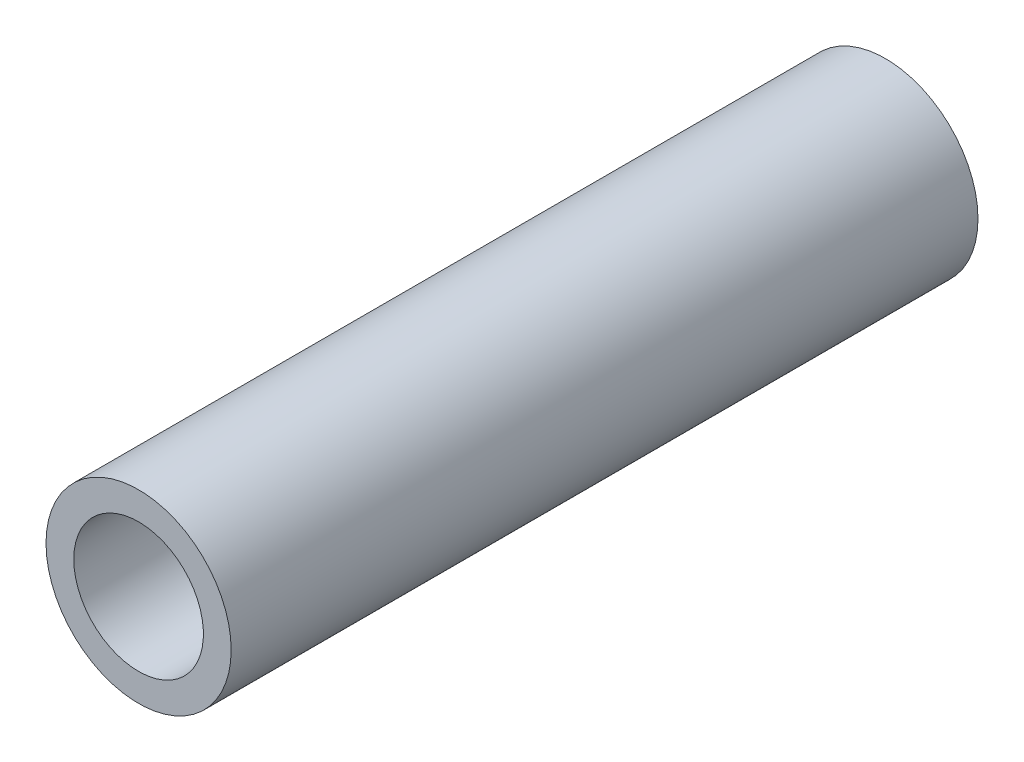
ISO-10303-21;
HEADER;
FILE_DESCRIPTION(('STEP AP214'),'2;1');
FILE_NAME('part.step','',(''),(''),'','','');
FILE_SCHEMA(('AUTOMOTIVE_DESIGN { 1 0 10303 214 1 1 1 1 }'));
ENDSEC;
DATA;
#1=APPLICATION_CONTEXT('core data for automotive mechanical design processes');
#2=APPLICATION_PROTOCOL_DEFINITION('international standard','automotive_design',2000,#1);
#3=PRODUCT_CONTEXT('',#1,'mechanical');
#4=PRODUCT('Part','Part','',(#3));
#5=PRODUCT_RELATED_PRODUCT_CATEGORY('part','',(#4));
#6=PRODUCT_DEFINITION_FORMATION('','',#4);
#7=PRODUCT_DEFINITION_CONTEXT('part definition',#1,'design');
#8=PRODUCT_DEFINITION('design','',#6,#7);
#9=PRODUCT_DEFINITION_SHAPE('','',#8);
#10=(LENGTH_UNIT() NAMED_UNIT(*) SI_UNIT(.MILLI.,.METRE.));
#11=(NAMED_UNIT(*) PLANE_ANGLE_UNIT() SI_UNIT($,.RADIAN.));
#12=(NAMED_UNIT(*) SI_UNIT($,.STERADIAN.) SOLID_ANGLE_UNIT());
#13=UNCERTAINTY_MEASURE_WITH_UNIT(LENGTH_MEASURE(1.E-05),#10,'distance_accuracy_value','');
#14=(GEOMETRIC_REPRESENTATION_CONTEXT(3) GLOBAL_UNCERTAINTY_ASSIGNED_CONTEXT((#13)) GLOBAL_UNIT_ASSIGNED_CONTEXT((#10,
#11,#12)) REPRESENTATION_CONTEXT('',''));
#15=CARTESIAN_POINT('',(0.,0.,0.));
#16=DIRECTION('',(0.,0.,1.));
#17=DIRECTION('',(1.,0.,0.));
#18=AXIS2_PLACEMENT_3D('',#15,#16,#17);
#19=CARTESIAN_POINT('',(5.25,0.,51.5));
#20=DIRECTION('',(0.,0.,-1.));
#21=DIRECTION('',(-1.,0.,0.));
#22=AXIS2_PLACEMENT_3D('',#19,#20,#21);
#23=PLANE('',#22);
#24=CARTESIAN_POINT('',(0.,0.,51.5));
#25=DIRECTION('',(0.,0.,1.));
#26=DIRECTION('',(1.,0.,0.));
#27=AXIS2_PLACEMENT_3D('',#24,#25,#26);
#28=CIRCLE('',#27,5.4);
#29=CARTESIAN_POINT('',(5.4,0.,51.5));
#30=VERTEX_POINT('',#29);
#31=EDGE_CURVE('E39',#30,#30,#28,.T.);
#32=ORIENTED_EDGE('',*,*,#31,.T.);
#33=EDGE_LOOP('',(#32));
#34=FACE_BOUND('',#33,.T.);
#35=CARTESIAN_POINT('',(0.,0.,51.5));
#36=DIRECTION('',(0.,0.,-1.));
#37=DIRECTION('',(-1.,0.,0.));
#38=AXIS2_PLACEMENT_3D('',#35,#36,#37);
#39=CIRCLE('',#38,5.25);
#40=CARTESIAN_POINT('',(-5.25,0.,51.5));
#41=VERTEX_POINT('',#40);
#42=EDGE_CURVE('E64',#41,#41,#39,.T.);
#43=ORIENTED_EDGE('',*,*,#42,.T.);
#44=EDGE_LOOP('',(#43));
#45=FACE_BOUND('',#44,.T.);
#46=ADVANCED_FACE('F36',(#34,#45),#23,.F.);
#47=CARTESIAN_POINT('',(0.,0.,64.4051778711081));
#48=DIRECTION('',(0.,0.,1.));
#49=DIRECTION('',(1.,0.,0.));
#50=AXIS2_PLACEMENT_3D('',#47,#48,#49);
#51=CYLINDRICAL_SURFACE('',#50,5.4);
#52=ORIENTED_EDGE('',*,*,#31,.F.);
#53=EDGE_LOOP('',(#52));
#54=FACE_BOUND('',#53,.T.);
#55=CARTESIAN_POINT('',(0.,0.,53.));
#56=DIRECTION('',(0.,0.,1.));
#57=DIRECTION('',(1.,0.,0.));
#58=AXIS2_PLACEMENT_3D('',#55,#56,#57);
#59=CIRCLE('',#58,5.4);
#60=CARTESIAN_POINT('',(5.4,0.,53.));
#61=VERTEX_POINT('',#60);
#62=EDGE_CURVE('E62',#61,#61,#59,.T.);
#63=ORIENTED_EDGE('',*,*,#62,.T.);
#64=EDGE_LOOP('',(#63));
#65=FACE_BOUND('',#64,.T.);
#66=ADVANCED_FACE('F110',(#54,#65),#51,.F.);
#67=CARTESIAN_POINT('',(0.,0.,60.5));
#68=DIRECTION('',(0.,0.,-1.));
#69=DIRECTION('',(-1.,0.,0.));
#70=AXIS2_PLACEMENT_3D('',#67,#68,#69);
#71=CYLINDRICAL_SURFACE('',#70,5.25);
#72=ORIENTED_EDGE('',*,*,#42,.F.);
#73=EDGE_LOOP('',(#72));
#74=FACE_BOUND('',#73,.T.);
#75=CARTESIAN_POINT('',(0.,0.,6.));
#76=DIRECTION('',(0.,0.,-1.));
#77=DIRECTION('',(-1.,0.,0.));
#78=AXIS2_PLACEMENT_3D('',#75,#76,#77);
#79=CIRCLE('',#78,5.25);
#80=CARTESIAN_POINT('',(-5.25,0.,6.));
#81=VERTEX_POINT('',#80);
#82=EDGE_CURVE('E59',#81,#81,#79,.T.);
#83=ORIENTED_EDGE('',*,*,#82,.T.);
#84=EDGE_LOOP('',(#83));
#85=FACE_BOUND('',#84,.T.);
#86=ADVANCED_FACE('F107',(#74,#85),#71,.F.);
#87=CARTESIAN_POINT('',(5.25,0.,53.));
#88=DIRECTION('',(0.,0.,1.));
#89=DIRECTION('',(1.,0.,0.));
#90=AXIS2_PLACEMENT_3D('',#87,#88,#89);
#91=PLANE('',#90);
#92=CARTESIAN_POINT('',(0.,0.,53.));
#93=DIRECTION('',(0.,0.,-1.));
#94=DIRECTION('',(-1.,0.,0.));
#95=AXIS2_PLACEMENT_3D('',#92,#93,#94);
#96=CIRCLE('',#95,5.25);
#97=CARTESIAN_POINT('',(-5.25,0.,53.));
#98=VERTEX_POINT('',#97);
#99=EDGE_CURVE('E56',#98,#98,#96,.F.);
#100=ORIENTED_EDGE('',*,*,#99,.T.);
#101=EDGE_LOOP('',(#100));
#102=FACE_BOUND('',#101,.T.);
#103=ORIENTED_EDGE('',*,*,#62,.F.);
#104=EDGE_LOOP('',(#103));
#105=FACE_BOUND('',#104,.T.);
#106=ADVANCED_FACE('F103',(#102,#105),#91,.F.);
#107=CARTESIAN_POINT('',(0.,0.,6.));
#108=DIRECTION('',(0.,0.,-1.));
#109=DIRECTION('',(-1.,0.,0.));
#110=AXIS2_PLACEMENT_3D('',#107,#108,#109);
#111=PLANE('',#110);
#112=ORIENTED_EDGE('',*,*,#82,.F.);
#113=EDGE_LOOP('',(#112));
#114=FACE_BOUND('',#113,.T.);
#115=CARTESIAN_POINT('',(0.,0.,6.));
#116=DIRECTION('',(0.,0.,-1.));
#117=DIRECTION('',(-1.,0.,0.));
#118=AXIS2_PLACEMENT_3D('',#115,#116,#117);
#119=CIRCLE('',#118,2.5);
#120=CARTESIAN_POINT('',(-2.5,0.,6.));
#121=VERTEX_POINT('',#120);
#122=EDGE_CURVE('E48',#121,#121,#119,.T.);
#123=ORIENTED_EDGE('',*,*,#122,.T.);
#124=EDGE_LOOP('',(#123));
#125=FACE_BOUND('',#124,.T.);
#126=ADVANCED_FACE('F99',(#114,#125),#111,.F.);
#127=CARTESIAN_POINT('',(0.,0.,60.5));
#128=DIRECTION('',(0.,0.,-1.));
#129=DIRECTION('',(-1.,0.,0.));
#130=AXIS2_PLACEMENT_3D('',#127,#128,#129);
#131=CYLINDRICAL_SURFACE('',#130,5.25);
#132=CARTESIAN_POINT('',(0.,0.,60.5));
#133=DIRECTION('',(0.,0.,-1.));
#134=DIRECTION('',(-1.,0.,0.));
#135=AXIS2_PLACEMENT_3D('',#132,#133,#134);
#136=CIRCLE('',#135,5.25);
#137=CARTESIAN_POINT('',(-5.25,0.,60.5));
#138=VERTEX_POINT('',#137);
#139=EDGE_CURVE('E43',#138,#138,#136,.T.);
#140=ORIENTED_EDGE('',*,*,#139,.F.);
#141=EDGE_LOOP('',(#140));
#142=FACE_BOUND('',#141,.T.);
#143=ORIENTED_EDGE('',*,*,#99,.F.);
#144=EDGE_LOOP('',(#143));
#145=FACE_BOUND('',#144,.T.);
#146=ADVANCED_FACE('F92',(#142,#145),#131,.F.);
#147=CARTESIAN_POINT('',(0.,0.,6.));
#148=DIRECTION('',(0.,0.,-1.));
#149=DIRECTION('',(-1.,0.,0.));
#150=AXIS2_PLACEMENT_3D('',#147,#148,#149);
#151=CYLINDRICAL_SURFACE('',#150,2.5);
#152=ORIENTED_EDGE('',*,*,#122,.F.);
#153=EDGE_LOOP('',(#152));
#154=FACE_BOUND('',#153,.T.);
#155=CARTESIAN_POINT('',(0.,0.,0.));
#156=DIRECTION('',(0.,0.,-1.));
#157=DIRECTION('',(-1.,0.,0.));
#158=AXIS2_PLACEMENT_3D('',#155,#156,#157);
#159=CIRCLE('',#158,2.5);
#160=CARTESIAN_POINT('',(-2.5,0.,0.));
#161=VERTEX_POINT('',#160);
#162=EDGE_CURVE('E10',#161,#161,#159,.T.);
#163=ORIENTED_EDGE('',*,*,#162,.T.);
#164=EDGE_LOOP('',(#163));
#165=FACE_BOUND('',#164,.T.);
#166=ADVANCED_FACE('F83',(#154,#165),#151,.F.);
#167=CARTESIAN_POINT('',(0.,0.,60.5));
#168=DIRECTION('',(0.,0.,1.));
#169=DIRECTION('',(1.,0.,0.));
#170=AXIS2_PLACEMENT_3D('',#167,#168,#169);
#171=PLANE('',#170);
#172=ORIENTED_EDGE('',*,*,#139,.T.);
#173=EDGE_LOOP('',(#172));
#174=FACE_BOUND('',#173,.T.);
#175=CARTESIAN_POINT('',(0.,0.,60.5));
#176=DIRECTION('',(0.,0.,1.));
#177=DIRECTION('',(1.,0.,0.));
#178=AXIS2_PLACEMENT_3D('',#175,#176,#177);
#179=CIRCLE('',#178,7.5);
#180=CARTESIAN_POINT('',(7.5,0.,60.5));
#181=VERTEX_POINT('',#180);
#182=EDGE_CURVE('E51',#181,#181,#179,.F.);
#183=ORIENTED_EDGE('',*,*,#182,.F.);
#184=EDGE_LOOP('',(#183));
#185=FACE_BOUND('',#184,.T.);
#186=ADVANCED_FACE('F80',(#174,#185),#171,.T.);
#187=CARTESIAN_POINT('',(0.,0.,0.));
#188=DIRECTION('',(0.,0.,1.));
#189=DIRECTION('',(1.,0.,0.));
#190=AXIS2_PLACEMENT_3D('',#187,#188,#189);
#191=PLANE('',#190);
#192=ORIENTED_EDGE('',*,*,#162,.F.);
#193=EDGE_LOOP('',(#192));
#194=FACE_BOUND('',#193,.T.);
#195=CARTESIAN_POINT('',(0.,0.,0.));
#196=DIRECTION('',(0.,0.,-1.));
#197=DIRECTION('',(-1.,0.,0.));
#198=AXIS2_PLACEMENT_3D('',#195,#196,#197);
#199=CIRCLE('',#198,7.5);
#200=CARTESIAN_POINT('',(-7.5,0.,0.));
#201=VERTEX_POINT('',#200);
#202=EDGE_CURVE('E69',#201,#201,#199,.T.);
#203=ORIENTED_EDGE('',*,*,#202,.T.);
#204=EDGE_LOOP('',(#203));
#205=FACE_BOUND('',#204,.T.);
#206=ADVANCED_FACE('F82',(#194,#205),#191,.F.);
#207=CARTESIAN_POINT('',(0.,0.,81.7132034355964));
#208=DIRECTION('',(0.,0.,-1.));
#209=DIRECTION('',(-1.,0.,0.));
#210=AXIS2_PLACEMENT_3D('',#207,#208,#209);
#211=CYLINDRICAL_SURFACE('',#210,7.5);
#212=ORIENTED_EDGE('',*,*,#202,.F.);
#213=EDGE_LOOP('',(#212));
#214=FACE_BOUND('',#213,.T.);
#215=ORIENTED_EDGE('',*,*,#182,.T.);
#216=EDGE_LOOP('',(#215));
#217=FACE_BOUND('',#216,.T.);
#218=ADVANCED_FACE('F78',(#214,#217),#211,.T.);
#219=CLOSED_SHELL('',(#46,#66,#86,#106,#126,#146,#166,#186,#206,#218));
#220=MANIFOLD_SOLID_BREP('B2',#219);
#221=ADVANCED_BREP_SHAPE_REPRESENTATION('',(#18,#220),#14);
#222=SHAPE_DEFINITION_REPRESENTATION(#9,#221);
ENDSEC;
END-ISO-10303-21;
